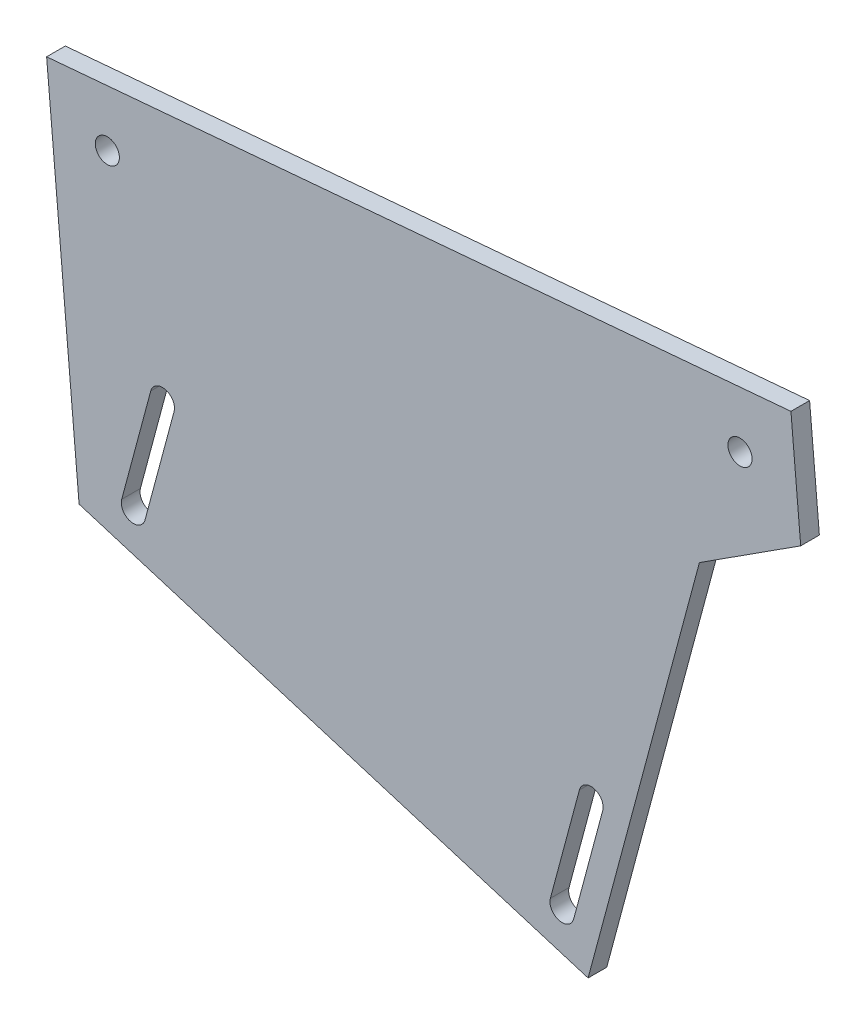
ISO-10303-21;
HEADER;
FILE_DESCRIPTION(('STEP AP214'),'2;1');
FILE_NAME('part.step','',(''),(''),'','','');
FILE_SCHEMA(('AUTOMOTIVE_DESIGN { 1 0 10303 214 1 1 1 1 }'));
ENDSEC;
DATA;
#1=APPLICATION_CONTEXT('core data for automotive mechanical design processes');
#2=APPLICATION_PROTOCOL_DEFINITION('international standard','automotive_design',2000,#1);
#3=PRODUCT_CONTEXT('',#1,'mechanical');
#4=PRODUCT('Part','Part','',(#3));
#5=PRODUCT_RELATED_PRODUCT_CATEGORY('part','',(#4));
#6=PRODUCT_DEFINITION_FORMATION('','',#4);
#7=PRODUCT_DEFINITION_CONTEXT('part definition',#1,'design');
#8=PRODUCT_DEFINITION('design','',#6,#7);
#9=PRODUCT_DEFINITION_SHAPE('','',#8);
#10=(LENGTH_UNIT() NAMED_UNIT(*) SI_UNIT(.MILLI.,.METRE.));
#11=(NAMED_UNIT(*) PLANE_ANGLE_UNIT() SI_UNIT($,.RADIAN.));
#12=(NAMED_UNIT(*) SI_UNIT($,.STERADIAN.) SOLID_ANGLE_UNIT());
#13=UNCERTAINTY_MEASURE_WITH_UNIT(LENGTH_MEASURE(1.E-05),#10,'distance_accuracy_value','');
#14=(GEOMETRIC_REPRESENTATION_CONTEXT(3) GLOBAL_UNCERTAINTY_ASSIGNED_CONTEXT((#13)) GLOBAL_UNIT_ASSIGNED_CONTEXT((#10,
#11,#12)) REPRESENTATION_CONTEXT('',''));
#15=CARTESIAN_POINT('',(0.,0.,0.));
#16=DIRECTION('',(0.,0.,1.));
#17=DIRECTION('',(1.,0.,0.));
#18=AXIS2_PLACEMENT_3D('',#15,#16,#17);
#19=CARTESIAN_POINT('',(334.683167092007,-89.6780843425941,6.35));
#20=DIRECTION('',(-0.965925826289068,0.258819045102522,0.));
#21=DIRECTION('',(-0.258819045102522,-0.965925826289068,0.));
#22=AXIS2_PLACEMENT_3D('',#19,#20,#21);
#23=PLANE('',#22);
#24=DIRECTION('',(0.258819045102522,0.965925826289068,0.));
#25=VECTOR('',#24,1.);
#26=CARTESIAN_POINT('',(334.683167092007,-89.6780843425941,0.));
#27=LINE('',#26,#25);
#28=CARTESIAN_POINT('',(347.922940958239,-40.2665755930926,0.));
#29=VERTEX_POINT('',#28);
#30=CARTESIAN_POINT('',(385.763827965819,100.957537322668,0.));
#31=VERTEX_POINT('',#30);
#32=EDGE_CURVE('E203',#29,#31,#27,.T.);
#33=ORIENTED_EDGE('',*,*,#32,.T.);
#34=DIRECTION('',(0.,0.,-1.));
#35=VECTOR('',#34,1.);
#36=CARTESIAN_POINT('',(385.763827965819,100.957537322668,6.35));
#37=LINE('',#36,#35);
#38=CARTESIAN_POINT('',(385.763827965819,100.957537322668,6.35));
#39=VERTEX_POINT('',#38);
#40=EDGE_CURVE('E11',#39,#31,#37,.T.);
#41=ORIENTED_EDGE('',*,*,#40,.F.);
#42=DIRECTION('',(0.258819045102522,0.965925826289068,0.));
#43=VECTOR('',#42,1.);
#44=CARTESIAN_POINT('',(334.683167092007,-89.6780843425941,6.35));
#45=LINE('',#44,#43);
#46=CARTESIAN_POINT('',(347.922940958239,-40.2665755930926,6.35));
#47=VERTEX_POINT('',#46);
#48=EDGE_CURVE('E277',#47,#39,#45,.T.);
#49=ORIENTED_EDGE('',*,*,#48,.F.);
#50=DIRECTION('',(0.,0.,-1.));
#51=VECTOR('',#50,1.);
#52=CARTESIAN_POINT('',(347.922940958239,-40.2665755930926,6.35));
#53=LINE('',#52,#51);
#54=EDGE_CURVE('E222',#47,#29,#53,.T.);
#55=ORIENTED_EDGE('',*,*,#54,.T.);
#56=EDGE_LOOP('',(#33,#41,#49,#55));
#57=FACE_BOUND('',#56,.T.);
#58=ADVANCED_FACE('F35',(#57),#23,.F.);
#59=CARTESIAN_POINT('',(66.8778894651875,-104.035064481891,6.35));
#60=DIRECTION('',(-0.540747322584853,0.841185076613531,0.));
#61=DIRECTION('',(-0.841185076613532,-0.540747322584853,0.));
#62=AXIS2_PLACEMENT_3D('',#59,#60,#61);
#63=PLANE('',#62);
#64=DIRECTION('',(0.841185076613532,0.540747322584853,0.));
#65=VECTOR('',#64,1.);
#66=CARTESIAN_POINT('',(66.8778894651875,-104.035064481891,0.));
#67=LINE('',#66,#65);
#68=CARTESIAN_POINT('',(420.197474592618,123.092858951571,0.));
#69=VERTEX_POINT('',#68);
#70=EDGE_CURVE('E206',#31,#69,#67,.T.);
#71=ORIENTED_EDGE('',*,*,#70,.T.);
#72=DIRECTION('',(0.,0.,-1.));
#73=VECTOR('',#72,1.);
#74=CARTESIAN_POINT('',(420.197474592618,123.092858951571,6.35));
#75=LINE('',#74,#73);
#76=CARTESIAN_POINT('',(420.197474592618,123.092858951571,6.35));
#77=VERTEX_POINT('',#76);
#78=EDGE_CURVE('E45',#77,#69,#75,.T.);
#79=ORIENTED_EDGE('',*,*,#78,.F.);
#80=DIRECTION('',(0.841185076613532,0.540747322584853,0.));
#81=VECTOR('',#80,1.);
#82=CARTESIAN_POINT('',(66.8778894651875,-104.035064481891,6.35));
#83=LINE('',#82,#81);
#84=EDGE_CURVE('E167',#39,#77,#83,.T.);
#85=ORIENTED_EDGE('',*,*,#84,.F.);
#86=ORIENTED_EDGE('',*,*,#40,.T.);
#87=EDGE_LOOP('',(#71,#79,#85,#86));
#88=FACE_BOUND('',#87,.T.);
#89=ADVANCED_FACE('F282',(#88),#63,.F.);
#90=CARTESIAN_POINT('',(427.693028004165,37.4182914194401,6.35));
#91=DIRECTION('',(0.996194698091746,0.0871557427476584,0.));
#92=DIRECTION('',(-0.0871557427476584,0.996194698091746,0.));
#93=AXIS2_PLACEMENT_3D('',#90,#91,#92);
#94=PLANE('',#93);
#95=DIRECTION('',(0.0871557427476584,-0.996194698091746,0.));
#96=VECTOR('',#95,1.);
#97=CARTESIAN_POINT('',(427.693028004165,37.4182914194401,0.));
#98=LINE('',#97,#96);
#99=CARTESIAN_POINT('',(416.876840793932,161.047876948866,0.));
#100=VERTEX_POINT('',#99);
#101=EDGE_CURVE('E209',#100,#69,#98,.T.);
#102=ORIENTED_EDGE('',*,*,#101,.F.);
#103=DIRECTION('',(0.,0.,-1.));
#104=VECTOR('',#103,1.);
#105=CARTESIAN_POINT('',(416.876840793932,161.047876948866,6.35));
#106=LINE('',#105,#104);
#107=CARTESIAN_POINT('',(416.876840793932,161.047876948866,6.35));
#108=VERTEX_POINT('',#107);
#109=EDGE_CURVE('E155',#108,#100,#106,.T.);
#110=ORIENTED_EDGE('',*,*,#109,.F.);
#111=DIRECTION('',(0.0871557427476584,-0.996194698091746,0.));
#112=VECTOR('',#111,1.);
#113=CARTESIAN_POINT('',(427.693028004165,37.4182914194401,6.35));
#114=LINE('',#113,#112);
#115=EDGE_CURVE('E165',#108,#77,#114,.T.);
#116=ORIENTED_EDGE('',*,*,#115,.T.);
#117=ORIENTED_EDGE('',*,*,#78,.T.);
#118=EDGE_LOOP('',(#102,#110,#116,#117));
#119=FACE_BOUND('',#118,.T.);
#120=ADVANCED_FACE('F285',(#119),#94,.T.);
#121=CARTESIAN_POINT('',(-10.8161872102334,123.629585529426,6.35));
#122=DIRECTION('',(-0.0871557427476579,0.996194698091746,0.));
#123=DIRECTION('',(-0.996194698091746,-0.0871557427476579,0.));
#124=AXIS2_PLACEMENT_3D('',#121,#122,#123);
#125=PLANE('',#124);
#126=DIRECTION('',(0.996194698091746,0.087155742747658,0.));
#127=VECTOR('',#126,1.);
#128=CARTESIAN_POINT('',(-10.8161872102334,123.629585529426,0.));
#129=LINE('',#128,#127);
#130=CARTESIAN_POINT('',(163.843387478628,138.910318290961,0.));
#131=VERTEX_POINT('',#130);
#132=EDGE_CURVE('E154',#131,#100,#129,.T.);
#133=ORIENTED_EDGE('',*,*,#132,.F.);
#134=DIRECTION('',(0.,0.,-1.));
#135=VECTOR('',#134,1.);
#136=CARTESIAN_POINT('',(163.843387478628,138.910318290961,6.35));
#137=LINE('',#136,#135);
#138=CARTESIAN_POINT('',(163.843387478628,138.910318290961,6.35));
#139=VERTEX_POINT('',#138);
#140=EDGE_CURVE('E148',#139,#131,#137,.T.);
#141=ORIENTED_EDGE('',*,*,#140,.F.);
#142=DIRECTION('',(0.996194698091746,0.087155742747658,0.));
#143=VECTOR('',#142,1.);
#144=CARTESIAN_POINT('',(-10.8161872102334,123.629585529426,6.35));
#145=LINE('',#144,#143);
#146=EDGE_CURVE('E152',#139,#108,#145,.T.);
#147=ORIENTED_EDGE('',*,*,#146,.T.);
#148=ORIENTED_EDGE('',*,*,#109,.T.);
#149=EDGE_LOOP('',(#133,#141,#147,#148));
#150=FACE_BOUND('',#149,.T.);
#151=ADVANCED_FACE('F150',(#150),#125,.T.);
#152=CARTESIAN_POINT('',(174.659574688862,15.2807327615348,6.35));
#153=DIRECTION('',(0.996194698091746,0.087155742747658,0.));
#154=DIRECTION('',(-0.087155742747658,0.996194698091746,0.));
#155=AXIS2_PLACEMENT_3D('',#152,#153,#154);
#156=PLANE('',#155);
#157=DIRECTION('',(0.0871557427476581,-0.996194698091746,0.));
#158=VECTOR('',#157,1.);
#159=CARTESIAN_POINT('',(174.659574688862,15.2807327615348,0.));
#160=LINE('',#159,#158);
#161=CARTESIAN_POINT('',(174.883865248031,12.7170799392114,0.));
#162=VERTEX_POINT('',#161);
#163=EDGE_CURVE('E100',#131,#162,#160,.T.);
#164=ORIENTED_EDGE('',*,*,#163,.T.);
#165=DIRECTION('',(0.,0.,-1.));
#166=VECTOR('',#165,1.);
#167=CARTESIAN_POINT('',(174.883865248031,12.7170799392114,6.35));
#168=LINE('',#167,#166);
#169=CARTESIAN_POINT('',(174.883865248031,12.7170799392114,6.35));
#170=VERTEX_POINT('',#169);
#171=EDGE_CURVE('E156',#170,#162,#168,.T.);
#172=ORIENTED_EDGE('',*,*,#171,.F.);
#173=DIRECTION('',(0.0871557427476581,-0.996194698091746,0.));
#174=VECTOR('',#173,1.);
#175=CARTESIAN_POINT('',(174.659574688862,15.2807327615348,6.35));
#176=LINE('',#175,#174);
#177=EDGE_CURVE('E158',#139,#170,#176,.T.);
#178=ORIENTED_EDGE('',*,*,#177,.F.);
#179=ORIENTED_EDGE('',*,*,#140,.T.);
#180=EDGE_LOOP('',(#164,#172,#178,#179));
#181=FACE_BOUND('',#180,.T.);
#182=ADVANCED_FACE('F159',(#181),#156,.F.);
#183=CARTESIAN_POINT('',(193.338994381594,20.3482260183865,6.35));
#184=DIRECTION('',(0.,0.,-1.));
#185=DIRECTION('',(-1.,0.,0.));
#186=AXIS2_PLACEMENT_3D('',#183,#184,#185);
#187=CYLINDRICAL_SURFACE('',#186,4.1021);
#188=CARTESIAN_POINT('',(193.338994381594,20.3482260183865,0.));
#189=DIRECTION('',(0.,0.,1.));
#190=DIRECTION('',(1.,0.,0.));
#191=AXIS2_PLACEMENT_3D('',#188,#189,#190);
#192=CIRCLE('',#191,4.1021);
#193=CARTESIAN_POINT('',(189.376670049574,21.4099276233016,0.));
#194=VERTEX_POINT('',#193);
#195=CARTESIAN_POINT('',(197.301318713614,19.2865244134715,0.));
#196=VERTEX_POINT('',#195);
#197=EDGE_CURVE('E191',#194,#196,#192,.T.);
#198=ORIENTED_EDGE('',*,*,#197,.F.);
#199=DIRECTION('',(0.,0.,-1.));
#200=VECTOR('',#199,1.);
#201=CARTESIAN_POINT('',(189.376670049574,21.4099276233016,6.35));
#202=LINE('',#201,#200);
#203=CARTESIAN_POINT('',(189.376670049574,21.4099276233016,6.35));
#204=VERTEX_POINT('',#203);
#205=EDGE_CURVE('E224',#204,#194,#202,.T.);
#206=ORIENTED_EDGE('',*,*,#205,.F.);
#207=CARTESIAN_POINT('',(193.338994381594,20.3482260183865,6.35));
#208=DIRECTION('',(0.,0.,1.));
#209=DIRECTION('',(1.,0.,0.));
#210=AXIS2_PLACEMENT_3D('',#207,#208,#209);
#211=CIRCLE('',#210,4.1021);
#212=CARTESIAN_POINT('',(197.301318713614,19.2865244134715,6.35));
#213=VERTEX_POINT('',#212);
#214=EDGE_CURVE('E260',#204,#213,#211,.T.);
#215=ORIENTED_EDGE('',*,*,#214,.T.);
#216=DIRECTION('',(0.,0.,-1.));
#217=VECTOR('',#216,1.);
#218=CARTESIAN_POINT('',(197.301318713614,19.2865244134715,6.35));
#219=LINE('',#218,#217);
#220=EDGE_CURVE('E228',#213,#196,#219,.T.);
#221=ORIENTED_EDGE('',*,*,#220,.T.);
#222=EDGE_LOOP('',(#198,#206,#215,#221));
#223=FACE_BOUND('',#222,.T.);
#224=ADVANCED_FACE('F319',(#223),#187,.F.);
#225=CARTESIAN_POINT('',(171.338356692478,-45.9099743082254,6.35));
#226=DIRECTION('',(0.965925826289068,-0.258819045102522,0.));
#227=DIRECTION('',(0.258819045102522,0.965925826289068,0.));
#228=AXIS2_PLACEMENT_3D('',#225,#226,#227);
#229=PLANE('',#228);
#230=DIRECTION('',(-0.258819045102522,-0.965925826289068,0.));
#231=VECTOR('',#230,1.);
#232=CARTESIAN_POINT('',(171.338356692478,-45.9099743082254,0.));
#233=LINE('',#232,#231);
#234=CARTESIAN_POINT('',(199.237675667979,58.2117016049137,0.));
#235=VERTEX_POINT('',#234);
#236=EDGE_CURVE('E194',#235,#194,#233,.T.);
#237=ORIENTED_EDGE('',*,*,#236,.F.);
#238=DIRECTION('',(0.,0.,-1.));
#239=VECTOR('',#238,1.);
#240=CARTESIAN_POINT('',(199.237675667979,58.2117016049137,6.35));
#241=LINE('',#240,#239);
#242=CARTESIAN_POINT('',(199.237675667979,58.2117016049137,6.35));
#243=VERTEX_POINT('',#242);
#244=EDGE_CURVE('E232',#243,#235,#241,.T.);
#245=ORIENTED_EDGE('',*,*,#244,.F.);
#246=DIRECTION('',(-0.258819045102522,-0.965925826289068,0.));
#247=VECTOR('',#246,1.);
#248=CARTESIAN_POINT('',(171.338356692478,-45.9099743082254,6.35));
#249=LINE('',#248,#247);
#250=EDGE_CURVE('E269',#243,#204,#249,.T.);
#251=ORIENTED_EDGE('',*,*,#250,.T.);
#252=ORIENTED_EDGE('',*,*,#205,.T.);
#253=EDGE_LOOP('',(#237,#245,#251,#252));
#254=FACE_BOUND('',#253,.T.);
#255=ADVANCED_FACE('F315',(#254),#229,.T.);
#256=CARTESIAN_POINT('',(203.2,57.15,6.35));
#257=DIRECTION('',(0.,0.,-1.));
#258=DIRECTION('',(-1.,0.,0.));
#259=AXIS2_PLACEMENT_3D('',#256,#257,#258);
#260=CYLINDRICAL_SURFACE('',#259,4.10210000000002);
#261=CARTESIAN_POINT('',(203.2,57.15,0.));
#262=DIRECTION('',(0.,0.,1.));
#263=DIRECTION('',(1.,0.,0.));
#264=AXIS2_PLACEMENT_3D('',#261,#262,#263);
#265=CIRCLE('',#264,4.10210000000002);
#266=CARTESIAN_POINT('',(207.16232433202,56.088298395085,0.));
#267=VERTEX_POINT('',#266);
#268=EDGE_CURVE('E197',#267,#235,#265,.T.);
#269=ORIENTED_EDGE('',*,*,#268,.F.);
#270=DIRECTION('',(0.,0.,-1.));
#271=VECTOR('',#270,1.);
#272=CARTESIAN_POINT('',(207.16232433202,56.088298395085,6.35));
#273=LINE('',#272,#271);
#274=CARTESIAN_POINT('',(207.16232433202,56.088298395085,6.35));
#275=VERTEX_POINT('',#274);
#276=EDGE_CURVE('E230',#275,#267,#273,.T.);
#277=ORIENTED_EDGE('',*,*,#276,.F.);
#278=CARTESIAN_POINT('',(203.2,57.15,6.35));
#279=DIRECTION('',(0.,0.,1.));
#280=DIRECTION('',(1.,0.,0.));
#281=AXIS2_PLACEMENT_3D('',#278,#279,#280);
#282=CIRCLE('',#281,4.10210000000002);
#283=EDGE_CURVE('E272',#275,#243,#282,.T.);
#284=ORIENTED_EDGE('',*,*,#283,.T.);
#285=ORIENTED_EDGE('',*,*,#244,.T.);
#286=EDGE_LOOP('',(#269,#277,#284,#285));
#287=FACE_BOUND('',#286,.T.);
#288=ADVANCED_FACE('F312',(#287),#260,.F.);
#289=CARTESIAN_POINT('',(339.060918604239,-24.2710613005506,6.35));
#290=DIRECTION('',(0.,0.,-1.));
#291=DIRECTION('',(-1.,0.,0.));
#292=AXIS2_PLACEMENT_3D('',#289,#290,#291);
#293=CYLINDRICAL_SURFACE('',#292,4.10209999999999);
#294=CARTESIAN_POINT('',(339.060918604239,-24.2710613005506,0.));
#295=DIRECTION('',(0.,0.,1.));
#296=DIRECTION('',(1.,0.,0.));
#297=AXIS2_PLACEMENT_3D('',#294,#295,#296);
#298=CIRCLE('',#297,4.10209999999999);
#299=CARTESIAN_POINT('',(335.098594272218,-23.2093596956356,0.));
#300=VERTEX_POINT('',#299);
#301=CARTESIAN_POINT('',(343.023242936259,-25.3327629054658,0.));
#302=VERTEX_POINT('',#301);
#303=EDGE_CURVE('E179',#300,#302,#298,.T.);
#304=ORIENTED_EDGE('',*,*,#303,.F.);
#305=DIRECTION('',(0.,0.,-1.));
#306=VECTOR('',#305,1.);
#307=CARTESIAN_POINT('',(335.098594272218,-23.2093596956356,6.35));
#308=LINE('',#307,#306);
#309=CARTESIAN_POINT('',(335.098594272218,-23.2093596956356,6.35));
#310=VERTEX_POINT('',#309);
#311=EDGE_CURVE('E39',#310,#300,#308,.T.);
#312=ORIENTED_EDGE('',*,*,#311,.F.);
#313=CARTESIAN_POINT('',(339.060918604239,-24.2710613005506,6.35));
#314=DIRECTION('',(0.,0.,1.));
#315=DIRECTION('',(1.,0.,0.));
#316=AXIS2_PLACEMENT_3D('',#313,#314,#315);
#317=CIRCLE('',#316,4.10209999999999);
#318=CARTESIAN_POINT('',(343.023242936259,-25.3327629054658,6.35));
#319=VERTEX_POINT('',#318);
#320=EDGE_CURVE('E221',#310,#319,#317,.T.);
#321=ORIENTED_EDGE('',*,*,#320,.T.);
#322=DIRECTION('',(0.,0.,-1.));
#323=VECTOR('',#322,1.);
#324=CARTESIAN_POINT('',(343.023242936259,-25.3327629054658,6.35));
#325=LINE('',#324,#323);
#326=EDGE_CURVE('E178',#319,#302,#325,.T.);
#327=ORIENTED_EDGE('',*,*,#326,.T.);
#328=EDGE_LOOP('',(#304,#312,#321,#327));
#329=FACE_BOUND('',#328,.T.);
#330=ADVANCED_FACE('F37',(#329),#293,.F.);
#331=CARTESIAN_POINT('',(318.453584766116,-85.3293808648769,6.35));
#332=DIRECTION('',(0.965925826289068,-0.258819045102521,0.));
#333=DIRECTION('',(0.258819045102521,0.965925826289068,0.));
#334=AXIS2_PLACEMENT_3D('',#331,#332,#333);
#335=PLANE('',#334);
#336=DIRECTION('',(-0.258819045102521,-0.965925826289068,0.));
#337=VECTOR('',#336,1.);
#338=CARTESIAN_POINT('',(318.453584766116,-85.3293808648769,0.));
#339=LINE('',#338,#337);
#340=CARTESIAN_POINT('',(344.959599890624,13.5924142859775,0.));
#341=VERTEX_POINT('',#340);
#342=EDGE_CURVE('E182',#341,#300,#339,.T.);
#343=ORIENTED_EDGE('',*,*,#342,.F.);
#344=DIRECTION('',(0.,0.,-1.));
#345=VECTOR('',#344,1.);
#346=CARTESIAN_POINT('',(344.959599890624,13.5924142859775,6.35));
#347=LINE('',#346,#345);
#348=CARTESIAN_POINT('',(344.959599890624,13.5924142859775,6.35));
#349=VERTEX_POINT('',#348);
#350=EDGE_CURVE('E237',#349,#341,#347,.T.);
#351=ORIENTED_EDGE('',*,*,#350,.F.);
#352=DIRECTION('',(-0.258819045102521,-0.965925826289068,0.));
#353=VECTOR('',#352,1.);
#354=CARTESIAN_POINT('',(318.453584766116,-85.3293808648769,6.35));
#355=LINE('',#354,#353);
#356=EDGE_CURVE('E246',#349,#310,#355,.T.);
#357=ORIENTED_EDGE('',*,*,#356,.T.);
#358=ORIENTED_EDGE('',*,*,#311,.T.);
#359=EDGE_LOOP('',(#343,#351,#357,#358));
#360=FACE_BOUND('',#359,.T.);
#361=ADVANCED_FACE('F244',(#360),#335,.T.);
#362=CARTESIAN_POINT('',(348.921924222645,12.5307126810628,6.35));
#363=DIRECTION('',(0.,0.,-1.));
#364=DIRECTION('',(-1.,0.,0.));
#365=AXIS2_PLACEMENT_3D('',#362,#363,#364);
#366=CYLINDRICAL_SURFACE('',#365,4.10209999999996);
#367=CARTESIAN_POINT('',(348.921924222645,12.5307126810628,0.));
#368=DIRECTION('',(0.,0.,1.));
#369=DIRECTION('',(1.,0.,0.));
#370=AXIS2_PLACEMENT_3D('',#367,#368,#369);
#371=CIRCLE('',#370,4.10209999999996);
#372=CARTESIAN_POINT('',(352.884248554665,11.4690110761474,0.));
#373=VERTEX_POINT('',#372);
#374=EDGE_CURVE('E185',#373,#341,#371,.T.);
#375=ORIENTED_EDGE('',*,*,#374,.F.);
#376=DIRECTION('',(0.,0.,-1.));
#377=VECTOR('',#376,1.);
#378=CARTESIAN_POINT('',(352.884248554665,11.4690110761474,6.35));
#379=LINE('',#378,#377);
#380=CARTESIAN_POINT('',(352.884248554665,11.4690110761474,6.35));
#381=VERTEX_POINT('',#380);
#382=EDGE_CURVE('E236',#381,#373,#379,.T.);
#383=ORIENTED_EDGE('',*,*,#382,.F.);
#384=CARTESIAN_POINT('',(348.921924222645,12.5307126810628,6.35));
#385=DIRECTION('',(0.,0.,1.));
#386=DIRECTION('',(1.,0.,0.));
#387=AXIS2_PLACEMENT_3D('',#384,#385,#386);
#388=CIRCLE('',#387,4.10209999999996);
#389=EDGE_CURVE('E255',#381,#349,#388,.T.);
#390=ORIENTED_EDGE('',*,*,#389,.T.);
#391=ORIENTED_EDGE('',*,*,#350,.T.);
#392=EDGE_LOOP('',(#375,#383,#390,#391));
#393=FACE_BOUND('',#392,.T.);
#394=ADVANCED_FACE('F252',(#393),#366,.F.);
#395=CARTESIAN_POINT('',(399.559648694627,140.410051050876,6.35));
#396=DIRECTION('',(0.,0.,-1.));
#397=DIRECTION('',(-1.,0.,0.));
#398=AXIS2_PLACEMENT_3D('',#395,#396,#397);
#399=CYLINDRICAL_SURFACE('',#398,4.10209999999999);
#400=CARTESIAN_POINT('',(399.559648694627,140.410051050876,6.35));
#401=DIRECTION('',(0.,0.,1.));
#402=DIRECTION('',(1.,0.,0.));
#403=AXIS2_PLACEMENT_3D('',#400,#401,#402);
#404=CIRCLE('',#403,4.10209999999999);
#405=CARTESIAN_POINT('',(403.661748694627,140.410051050876,6.35));
#406=VERTEX_POINT('',#405);
#407=EDGE_CURVE('E172',#406,#406,#404,.T.);
#408=ORIENTED_EDGE('',*,*,#407,.T.);
#409=EDGE_LOOP('',(#408));
#410=FACE_BOUND('',#409,.T.);
#411=CARTESIAN_POINT('',(399.559648694627,140.410051050876,0.));
#412=DIRECTION('',(0.,0.,1.));
#413=DIRECTION('',(1.,0.,0.));
#414=AXIS2_PLACEMENT_3D('',#411,#412,#413);
#415=CIRCLE('',#414,4.10209999999999);
#416=CARTESIAN_POINT('',(403.661748694627,140.410051050876,0.));
#417=VERTEX_POINT('',#416);
#418=EDGE_CURVE('E215',#417,#417,#415,.T.);
#419=ORIENTED_EDGE('',*,*,#418,.F.);
#420=EDGE_LOOP('',(#419));
#421=FACE_BOUND('',#420,.T.);
#422=ADVANCED_FACE('F293',(#410,#421),#399,.F.);
#423=CARTESIAN_POINT('',(18.5509318256813,60.5854025062845,6.35));
#424=DIRECTION('',(0.292777475846045,0.956180605135462,0.));
#425=DIRECTION('',(-0.956180605135462,0.292777475846045,0.));
#426=AXIS2_PLACEMENT_3D('',#423,#424,#425);
#427=PLANE('',#426);
#428=DIRECTION('',(0.956180605135462,-0.292777475846045,0.));
#429=VECTOR('',#428,1.);
#430=CARTESIAN_POINT('',(18.5509318256813,60.5854025062845,0.));
#431=LINE('',#430,#429);
#432=EDGE_CURVE('E106',#162,#29,#431,.T.);
#433=ORIENTED_EDGE('',*,*,#432,.T.);
#434=ORIENTED_EDGE('',*,*,#54,.F.);
#435=DIRECTION('',(0.956180605135462,-0.292777475846045,0.));
#436=VECTOR('',#435,1.);
#437=CARTESIAN_POINT('',(18.5509318256813,60.5854025062845,6.35));
#438=LINE('',#437,#436);
#439=EDGE_CURVE('E54',#170,#47,#438,.T.);
#440=ORIENTED_EDGE('',*,*,#439,.F.);
#441=ORIENTED_EDGE('',*,*,#171,.T.);
#442=EDGE_LOOP('',(#433,#434,#440,#441));
#443=FACE_BOUND('',#442,.T.);
#444=ADVANCED_FACE('F290',(#443),#427,.F.);
#445=CARTESIAN_POINT('',(179.263005356519,-48.0333775180557,6.35));
#446=DIRECTION('',(0.965925826289068,-0.258819045102523,0.));
#447=DIRECTION('',(0.258819045102523,0.965925826289068,0.));
#448=AXIS2_PLACEMENT_3D('',#445,#446,#447);
#449=PLANE('',#448);
#450=DIRECTION('',(-0.258819045102523,-0.965925826289068,0.));
#451=VECTOR('',#450,1.);
#452=CARTESIAN_POINT('',(179.263005356519,-48.0333775180557,0.));
#453=LINE('',#452,#451);
#454=EDGE_CURVE('E200',#267,#196,#453,.T.);
#455=ORIENTED_EDGE('',*,*,#454,.T.);
#456=ORIENTED_EDGE('',*,*,#220,.F.);
#457=DIRECTION('',(-0.258819045102523,-0.965925826289068,0.));
#458=VECTOR('',#457,1.);
#459=CARTESIAN_POINT('',(179.263005356519,-48.0333775180557,6.35));
#460=LINE('',#459,#458);
#461=EDGE_CURVE('E275',#275,#213,#460,.T.);
#462=ORIENTED_EDGE('',*,*,#461,.F.);
#463=ORIENTED_EDGE('',*,*,#276,.T.);
#464=EDGE_LOOP('',(#455,#456,#462,#463));
#465=FACE_BOUND('',#464,.T.);
#466=ADVANCED_FACE('F292',(#465),#449,.F.);
#467=CARTESIAN_POINT('',(326.378233430157,-87.4527840747066,6.35));
#468=DIRECTION('',(0.965925826289068,-0.25881904510252,0.));
#469=DIRECTION('',(0.25881904510252,0.965925826289069,0.));
#470=AXIS2_PLACEMENT_3D('',#467,#468,#469);
#471=PLANE('',#470);
#472=DIRECTION('',(-0.25881904510252,-0.965925826289069,0.));
#473=VECTOR('',#472,1.);
#474=CARTESIAN_POINT('',(326.378233430157,-87.4527840747066,0.));
#475=LINE('',#474,#473);
#476=EDGE_CURVE('E188',#373,#302,#475,.T.);
#477=ORIENTED_EDGE('',*,*,#476,.T.);
#478=ORIENTED_EDGE('',*,*,#326,.F.);
#479=DIRECTION('',(-0.25881904510252,-0.965925826289069,0.));
#480=VECTOR('',#479,1.);
#481=CARTESIAN_POINT('',(326.378233430157,-87.4527840747066,6.35));
#482=LINE('',#481,#480);
#483=EDGE_CURVE('E257',#381,#319,#482,.T.);
#484=ORIENTED_EDGE('',*,*,#483,.F.);
#485=ORIENTED_EDGE('',*,*,#382,.T.);
#486=EDGE_LOOP('',(#477,#478,#484,#485));
#487=FACE_BOUND('',#486,.T.);
#488=ADVANCED_FACE('F258',(#487),#471,.F.);
#489=CARTESIAN_POINT('',(184.481213376619,121.593126191656,6.35));
#490=DIRECTION('',(0.,0.,-1.));
#491=DIRECTION('',(-1.,0.,0.));
#492=AXIS2_PLACEMENT_3D('',#489,#490,#491);
#493=CYLINDRICAL_SURFACE('',#492,4.10209999999991);
#494=CARTESIAN_POINT('',(184.481213376619,121.593126191656,6.35));
#495=DIRECTION('',(0.,0.,1.));
#496=DIRECTION('',(1.,0.,0.));
#497=AXIS2_PLACEMENT_3D('',#494,#495,#496);
#498=CIRCLE('',#497,4.10209999999991);
#499=CARTESIAN_POINT('',(188.583313376619,121.593126191656,6.35));
#500=VERTEX_POINT('',#499);
#501=EDGE_CURVE('E175',#500,#500,#498,.T.);
#502=ORIENTED_EDGE('',*,*,#501,.T.);
#503=EDGE_LOOP('',(#502));
#504=FACE_BOUND('',#503,.T.);
#505=CARTESIAN_POINT('',(184.481213376619,121.593126191656,0.));
#506=DIRECTION('',(0.,0.,1.));
#507=DIRECTION('',(1.,0.,0.));
#508=AXIS2_PLACEMENT_3D('',#505,#506,#507);
#509=CIRCLE('',#508,4.10209999999991);
#510=CARTESIAN_POINT('',(188.583313376619,121.593126191656,0.));
#511=VERTEX_POINT('',#510);
#512=EDGE_CURVE('E218',#511,#511,#509,.T.);
#513=ORIENTED_EDGE('',*,*,#512,.F.);
#514=EDGE_LOOP('',(#513));
#515=FACE_BOUND('',#514,.T.);
#516=ADVANCED_FACE('F326',(#504,#515),#493,.F.);
#517=CARTESIAN_POINT('',(0.,0.,6.35));
#518=DIRECTION('',(0.,0.,1.));
#519=DIRECTION('',(1.,0.,0.));
#520=AXIS2_PLACEMENT_3D('',#517,#518,#519);
#521=PLANE('',#520);
#522=ORIENTED_EDGE('',*,*,#320,.F.);
#523=ORIENTED_EDGE('',*,*,#356,.F.);
#524=ORIENTED_EDGE('',*,*,#389,.F.);
#525=ORIENTED_EDGE('',*,*,#483,.T.);
#526=EDGE_LOOP('',(#522,#523,#524,#525));
#527=FACE_BOUND('',#526,.T.);
#528=ORIENTED_EDGE('',*,*,#214,.F.);
#529=ORIENTED_EDGE('',*,*,#250,.F.);
#530=ORIENTED_EDGE('',*,*,#283,.F.);
#531=ORIENTED_EDGE('',*,*,#461,.T.);
#532=EDGE_LOOP('',(#528,#529,#530,#531));
#533=FACE_BOUND('',#532,.T.);
#534=ORIENTED_EDGE('',*,*,#48,.T.);
#535=ORIENTED_EDGE('',*,*,#84,.T.);
#536=ORIENTED_EDGE('',*,*,#115,.F.);
#537=ORIENTED_EDGE('',*,*,#146,.F.);
#538=ORIENTED_EDGE('',*,*,#177,.T.);
#539=ORIENTED_EDGE('',*,*,#439,.T.);
#540=EDGE_LOOP('',(#534,#535,#536,#537,#538,#539));
#541=FACE_BOUND('',#540,.T.);
#542=ORIENTED_EDGE('',*,*,#407,.F.);
#543=EDGE_LOOP('',(#542));
#544=FACE_BOUND('',#543,.T.);
#545=ORIENTED_EDGE('',*,*,#501,.F.);
#546=EDGE_LOOP('',(#545));
#547=FACE_BOUND('',#546,.T.);
#548=ADVANCED_FACE('F162',(#527,#533,#541,#544,#547),#521,.T.);
#549=CARTESIAN_POINT('',(0.,0.,0.));
#550=DIRECTION('',(0.,0.,1.));
#551=DIRECTION('',(1.,0.,0.));
#552=AXIS2_PLACEMENT_3D('',#549,#550,#551);
#553=PLANE('',#552);
#554=ORIENTED_EDGE('',*,*,#303,.T.);
#555=ORIENTED_EDGE('',*,*,#476,.F.);
#556=ORIENTED_EDGE('',*,*,#374,.T.);
#557=ORIENTED_EDGE('',*,*,#342,.T.);
#558=EDGE_LOOP('',(#554,#555,#556,#557));
#559=FACE_BOUND('',#558,.T.);
#560=ORIENTED_EDGE('',*,*,#197,.T.);
#561=ORIENTED_EDGE('',*,*,#454,.F.);
#562=ORIENTED_EDGE('',*,*,#268,.T.);
#563=ORIENTED_EDGE('',*,*,#236,.T.);
#564=EDGE_LOOP('',(#560,#561,#562,#563));
#565=FACE_BOUND('',#564,.T.);
#566=ORIENTED_EDGE('',*,*,#32,.F.);
#567=ORIENTED_EDGE('',*,*,#432,.F.);
#568=ORIENTED_EDGE('',*,*,#163,.F.);
#569=ORIENTED_EDGE('',*,*,#132,.T.);
#570=ORIENTED_EDGE('',*,*,#101,.T.);
#571=ORIENTED_EDGE('',*,*,#70,.F.);
#572=EDGE_LOOP('',(#566,#567,#568,#569,#570,#571));
#573=FACE_BOUND('',#572,.T.);
#574=ORIENTED_EDGE('',*,*,#418,.T.);
#575=EDGE_LOOP('',(#574));
#576=FACE_BOUND('',#575,.T.);
#577=ORIENTED_EDGE('',*,*,#512,.T.);
#578=EDGE_LOOP('',(#577));
#579=FACE_BOUND('',#578,.T.);
#580=ADVANCED_FACE('F250',(#559,#565,#573,#576,#579),#553,.F.);
#581=CLOSED_SHELL('',(#58,#89,#120,#151,#182,#224,#255,#288,#330,#361,#394,#422,#444,#466,#488,
#516,#548,#580));
#582=MANIFOLD_SOLID_BREP('B2',#581);
#583=ADVANCED_BREP_SHAPE_REPRESENTATION('',(#18,#582),#14);
#584=SHAPE_DEFINITION_REPRESENTATION(#9,#583);
ENDSEC;
END-ISO-10303-21;
